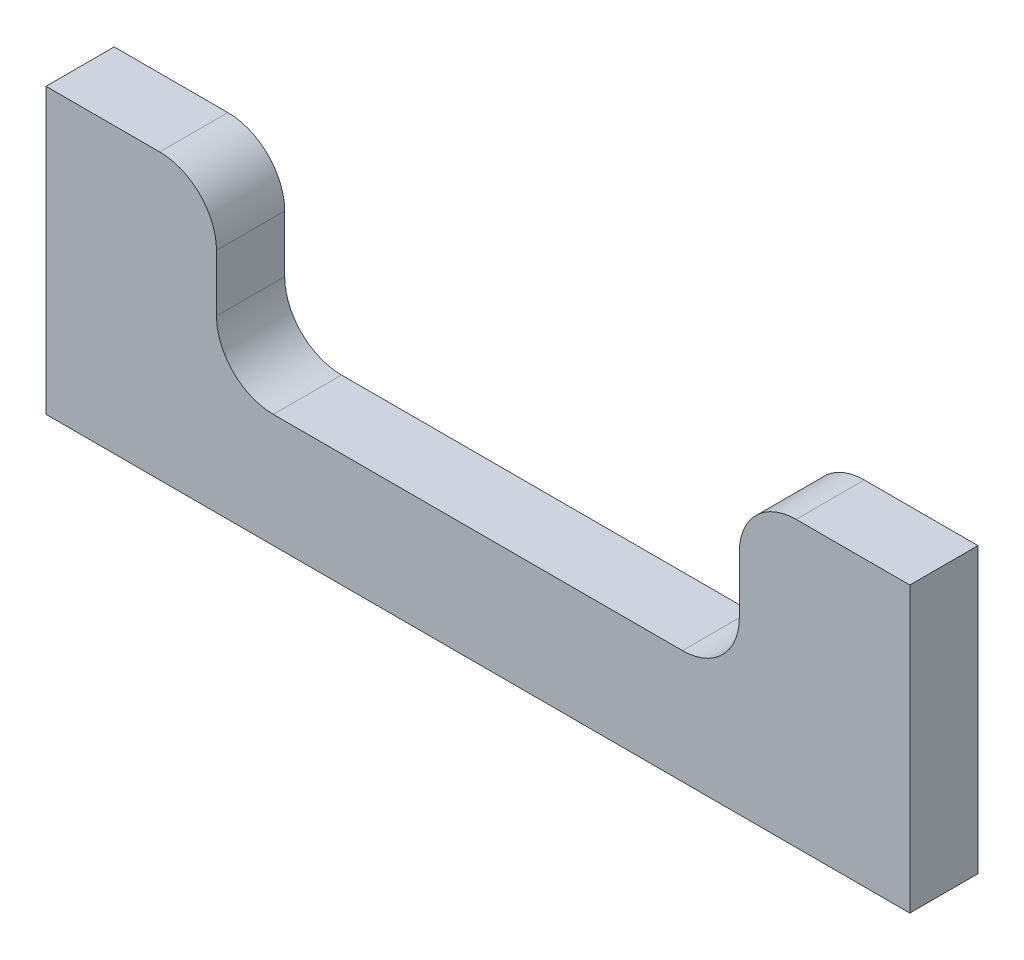
ISO-10303-21;
HEADER;
FILE_DESCRIPTION(('STEP AP214'),'2;1');
FILE_NAME('part.step','',(''),(''),'','','');
FILE_SCHEMA(('AUTOMOTIVE_DESIGN { 1 0 10303 214 1 1 1 1 }'));
ENDSEC;
DATA;
#1=APPLICATION_CONTEXT('core data for automotive mechanical design processes');
#2=APPLICATION_PROTOCOL_DEFINITION('international standard','automotive_design',2000,#1);
#3=PRODUCT_CONTEXT('',#1,'mechanical');
#4=PRODUCT('Part','Part','',(#3));
#5=PRODUCT_RELATED_PRODUCT_CATEGORY('part','',(#4));
#6=PRODUCT_DEFINITION_FORMATION('','',#4);
#7=PRODUCT_DEFINITION_CONTEXT('part definition',#1,'design');
#8=PRODUCT_DEFINITION('design','',#6,#7);
#9=PRODUCT_DEFINITION_SHAPE('','',#8);
#10=(LENGTH_UNIT() NAMED_UNIT(*) SI_UNIT(.MILLI.,.METRE.));
#11=(NAMED_UNIT(*) PLANE_ANGLE_UNIT() SI_UNIT($,.RADIAN.));
#12=(NAMED_UNIT(*) SI_UNIT($,.STERADIAN.) SOLID_ANGLE_UNIT());
#13=UNCERTAINTY_MEASURE_WITH_UNIT(LENGTH_MEASURE(1.E-05),#10,'distance_accuracy_value','');
#14=(GEOMETRIC_REPRESENTATION_CONTEXT(3) GLOBAL_UNCERTAINTY_ASSIGNED_CONTEXT((#13)) GLOBAL_UNIT_ASSIGNED_CONTEXT((#10,
#11,#12)) REPRESENTATION_CONTEXT('',''));
#15=CARTESIAN_POINT('',(0.,0.,0.));
#16=DIRECTION('',(0.,0.,1.));
#17=DIRECTION('',(1.,0.,0.));
#18=AXIS2_PLACEMENT_3D('',#15,#16,#17);
#19=CARTESIAN_POINT('',(23.,25.,6.));
#20=DIRECTION('',(1.,0.,0.));
#21=DIRECTION('',(0.,1.,0.));
#22=AXIS2_PLACEMENT_3D('',#19,#20,#21);
#23=PLANE('',#22);
#24=DIRECTION('',(0.,-1.,0.));
#25=VECTOR('',#24,1.);
#26=CARTESIAN_POINT('',(23.,25.,6.));
#27=LINE('',#26,#25);
#28=CARTESIAN_POINT('',(23.,20.,6.));
#29=VERTEX_POINT('',#28);
#30=CARTESIAN_POINT('',(23.,15.,6.));
#31=VERTEX_POINT('',#30);
#32=EDGE_CURVE('E177',#29,#31,#27,.T.);
#33=ORIENTED_EDGE('',*,*,#32,.F.);
#34=DIRECTION('',(0.,0.,-1.));
#35=VECTOR('',#34,1.);
#36=CARTESIAN_POINT('',(23.,20.,6.));
#37=LINE('',#36,#35);
#38=CARTESIAN_POINT('',(23.,20.,0.));
#39=VERTEX_POINT('',#38);
#40=EDGE_CURVE('E185',#29,#39,#37,.T.);
#41=ORIENTED_EDGE('',*,*,#40,.T.);
#42=DIRECTION('',(0.,-1.,0.));
#43=VECTOR('',#42,1.);
#44=CARTESIAN_POINT('',(23.,25.,0.));
#45=LINE('',#44,#43);
#46=CARTESIAN_POINT('',(23.,15.,0.));
#47=VERTEX_POINT('',#46);
#48=EDGE_CURVE('E159',#39,#47,#45,.T.);
#49=ORIENTED_EDGE('',*,*,#48,.T.);
#50=DIRECTION('',(0.,0.,-1.));
#51=VECTOR('',#50,1.);
#52=CARTESIAN_POINT('',(23.,15.,6.));
#53=LINE('',#52,#51);
#54=EDGE_CURVE('E143',#47,#31,#53,.F.);
#55=ORIENTED_EDGE('',*,*,#54,.T.);
#56=EDGE_LOOP('',(#33,#41,#49,#55));
#57=FACE_BOUND('',#56,.T.);
#58=ADVANCED_FACE('F37',(#57),#23,.F.);
#59=CARTESIAN_POINT('',(23.,9.99999999999999,6.));
#60=DIRECTION('',(0.,-1.,0.));
#61=DIRECTION('',(0.,0.,-1.));
#62=AXIS2_PLACEMENT_3D('',#59,#60,#61);
#63=PLANE('',#62);
#64=DIRECTION('',(-1.,0.,0.));
#65=VECTOR('',#64,1.);
#66=CARTESIAN_POINT('',(23.,9.99999999999999,6.));
#67=LINE('',#66,#65);
#68=CARTESIAN_POINT('',(18.,9.99999999999999,6.));
#69=VERTEX_POINT('',#68);
#70=CARTESIAN_POINT('',(-18.,9.99999999999999,6.));
#71=VERTEX_POINT('',#70);
#72=EDGE_CURVE('E226',#69,#71,#67,.T.);
#73=ORIENTED_EDGE('',*,*,#72,.F.);
#74=DIRECTION('',(0.,0.,-1.));
#75=VECTOR('',#74,1.);
#76=CARTESIAN_POINT('',(18.,9.99999999999999,0.));
#77=LINE('',#76,#75);
#78=CARTESIAN_POINT('',(18.,9.99999999999999,0.));
#79=VERTEX_POINT('',#78);
#80=EDGE_CURVE('E199',#69,#79,#77,.T.);
#81=ORIENTED_EDGE('',*,*,#80,.T.);
#82=DIRECTION('',(-1.,0.,0.));
#83=VECTOR('',#82,1.);
#84=CARTESIAN_POINT('',(23.,9.99999999999999,0.));
#85=LINE('',#84,#83);
#86=CARTESIAN_POINT('',(-18.,9.99999999999999,0.));
#87=VERTEX_POINT('',#86);
#88=EDGE_CURVE('E162',#79,#87,#85,.T.);
#89=ORIENTED_EDGE('',*,*,#88,.T.);
#90=DIRECTION('',(0.,0.,-1.));
#91=VECTOR('',#90,1.);
#92=CARTESIAN_POINT('',(-18.,9.99999999999999,6.));
#93=LINE('',#92,#91);
#94=EDGE_CURVE('E197',#87,#71,#93,.F.);
#95=ORIENTED_EDGE('',*,*,#94,.T.);
#96=EDGE_LOOP('',(#73,#81,#89,#95));
#97=FACE_BOUND('',#96,.T.);
#98=ADVANCED_FACE('F221',(#97),#63,.F.);
#99=CARTESIAN_POINT('',(-23.,25.,6.));
#100=DIRECTION('',(-1.,0.,0.));
#101=DIRECTION('',(0.,-1.,0.));
#102=AXIS2_PLACEMENT_3D('',#99,#100,#101);
#103=PLANE('',#102);
#104=DIRECTION('',(0.,1.,0.));
#105=VECTOR('',#104,1.);
#106=CARTESIAN_POINT('',(-23.,25.,6.));
#107=LINE('',#106,#105);
#108=CARTESIAN_POINT('',(-23.,15.,6.));
#109=VERTEX_POINT('',#108);
#110=CARTESIAN_POINT('',(-23.,20.,6.));
#111=VERTEX_POINT('',#110);
#112=EDGE_CURVE('E134',#109,#111,#107,.T.);
#113=ORIENTED_EDGE('',*,*,#112,.F.);
#114=DIRECTION('',(0.,0.,-1.));
#115=VECTOR('',#114,1.);
#116=CARTESIAN_POINT('',(-23.,15.,0.));
#117=LINE('',#116,#115);
#118=CARTESIAN_POINT('',(-23.,15.,0.));
#119=VERTEX_POINT('',#118);
#120=EDGE_CURVE('E203',#109,#119,#117,.T.);
#121=ORIENTED_EDGE('',*,*,#120,.T.);
#122=DIRECTION('',(0.,1.,0.));
#123=VECTOR('',#122,1.);
#124=CARTESIAN_POINT('',(-23.,25.,0.));
#125=LINE('',#124,#123);
#126=CARTESIAN_POINT('',(-23.,20.,0.));
#127=VERTEX_POINT('',#126);
#128=EDGE_CURVE('E165',#119,#127,#125,.T.);
#129=ORIENTED_EDGE('',*,*,#128,.T.);
#130=DIRECTION('',(0.,0.,-1.));
#131=VECTOR('',#130,1.);
#132=CARTESIAN_POINT('',(-23.,20.,6.));
#133=LINE('',#132,#131);
#134=EDGE_CURVE('E60',#127,#111,#133,.F.);
#135=ORIENTED_EDGE('',*,*,#134,.T.);
#136=EDGE_LOOP('',(#113,#121,#129,#135));
#137=FACE_BOUND('',#136,.T.);
#138=ADVANCED_FACE('F227',(#137),#103,.F.);
#139=CARTESIAN_POINT('',(-38.,25.,6.));
#140=DIRECTION('',(0.,-1.,0.));
#141=DIRECTION('',(1.,0.,0.));
#142=AXIS2_PLACEMENT_3D('',#139,#140,#141);
#143=PLANE('',#142);
#144=DIRECTION('',(-1.,0.,0.));
#145=VECTOR('',#144,1.);
#146=CARTESIAN_POINT('',(-38.,25.,6.));
#147=LINE('',#146,#145);
#148=CARTESIAN_POINT('',(-28.,25.,6.));
#149=VERTEX_POINT('',#148);
#150=CARTESIAN_POINT('',(-38.,25.,6.));
#151=VERTEX_POINT('',#150);
#152=EDGE_CURVE('E124',#149,#151,#147,.T.);
#153=ORIENTED_EDGE('',*,*,#152,.F.);
#154=DIRECTION('',(0.,0.,-1.));
#155=VECTOR('',#154,1.);
#156=CARTESIAN_POINT('',(-28.,25.,6.));
#157=LINE('',#156,#155);
#158=CARTESIAN_POINT('',(-28.,25.,0.));
#159=VERTEX_POINT('',#158);
#160=EDGE_CURVE('E206',#149,#159,#157,.T.);
#161=ORIENTED_EDGE('',*,*,#160,.T.);
#162=DIRECTION('',(-1.,0.,0.));
#163=VECTOR('',#162,1.);
#164=CARTESIAN_POINT('',(-38.,25.,0.));
#165=LINE('',#164,#163);
#166=CARTESIAN_POINT('',(-38.,25.,0.));
#167=VERTEX_POINT('',#166);
#168=EDGE_CURVE('E140',#159,#167,#165,.T.);
#169=ORIENTED_EDGE('',*,*,#168,.T.);
#170=DIRECTION('',(0.,0.,-1.));
#171=VECTOR('',#170,1.);
#172=CARTESIAN_POINT('',(-38.,25.,6.));
#173=LINE('',#172,#171);
#174=EDGE_CURVE('E137',#151,#167,#173,.T.);
#175=ORIENTED_EDGE('',*,*,#174,.F.);
#176=EDGE_LOOP('',(#153,#161,#169,#175));
#177=FACE_BOUND('',#176,.T.);
#178=ADVANCED_FACE('F138',(#177),#143,.F.);
#179=CARTESIAN_POINT('',(-38.,0.,6.));
#180=DIRECTION('',(1.,0.,0.));
#181=DIRECTION('',(0.,0.,-1.));
#182=AXIS2_PLACEMENT_3D('',#179,#180,#181);
#183=PLANE('',#182);
#184=DIRECTION('',(0.,-1.,0.));
#185=VECTOR('',#184,1.);
#186=CARTESIAN_POINT('',(-38.,0.,0.));
#187=LINE('',#186,#185);
#188=CARTESIAN_POINT('',(-38.,0.,0.));
#189=VERTEX_POINT('',#188);
#190=EDGE_CURVE('E168',#167,#189,#187,.T.);
#191=ORIENTED_EDGE('',*,*,#190,.T.);
#192=DIRECTION('',(0.,0.,-1.));
#193=VECTOR('',#192,1.);
#194=CARTESIAN_POINT('',(-38.,0.,6.));
#195=LINE('',#194,#193);
#196=CARTESIAN_POINT('',(-38.,0.,6.));
#197=VERTEX_POINT('',#196);
#198=EDGE_CURVE('E144',#197,#189,#195,.T.);
#199=ORIENTED_EDGE('',*,*,#198,.F.);
#200=DIRECTION('',(0.,-1.,0.));
#201=VECTOR('',#200,1.);
#202=CARTESIAN_POINT('',(-38.,0.,6.));
#203=LINE('',#202,#201);
#204=EDGE_CURVE('E129',#151,#197,#203,.T.);
#205=ORIENTED_EDGE('',*,*,#204,.F.);
#206=ORIENTED_EDGE('',*,*,#174,.T.);
#207=EDGE_LOOP('',(#191,#199,#205,#206));
#208=FACE_BOUND('',#207,.T.);
#209=ADVANCED_FACE('F146',(#208),#183,.F.);
#210=CARTESIAN_POINT('',(-38.,0.,6.));
#211=DIRECTION('',(0.,1.,0.));
#212=DIRECTION('',(0.,0.,1.));
#213=AXIS2_PLACEMENT_3D('',#210,#211,#212);
#214=PLANE('',#213);
#215=DIRECTION('',(1.,0.,0.));
#216=VECTOR('',#215,1.);
#217=CARTESIAN_POINT('',(-38.,0.,0.));
#218=LINE('',#217,#216);
#219=CARTESIAN_POINT('',(38.,0.,0.));
#220=VERTEX_POINT('',#219);
#221=EDGE_CURVE('E170',#189,#220,#218,.T.);
#222=ORIENTED_EDGE('',*,*,#221,.T.);
#223=DIRECTION('',(0.,0.,-1.));
#224=VECTOR('',#223,1.);
#225=CARTESIAN_POINT('',(38.,0.,6.));
#226=LINE('',#225,#224);
#227=CARTESIAN_POINT('',(38.,0.,6.));
#228=VERTEX_POINT('',#227);
#229=EDGE_CURVE('E180',#228,#220,#226,.T.);
#230=ORIENTED_EDGE('',*,*,#229,.F.);
#231=DIRECTION('',(1.,0.,0.));
#232=VECTOR('',#231,1.);
#233=CARTESIAN_POINT('',(-38.,0.,6.));
#234=LINE('',#233,#232);
#235=EDGE_CURVE('E149',#197,#228,#234,.T.);
#236=ORIENTED_EDGE('',*,*,#235,.F.);
#237=ORIENTED_EDGE('',*,*,#198,.T.);
#238=EDGE_LOOP('',(#222,#230,#236,#237));
#239=FACE_BOUND('',#238,.T.);
#240=ADVANCED_FACE('F254',(#239),#214,.F.);
#241=CARTESIAN_POINT('',(38.,0.,6.));
#242=DIRECTION('',(-1.,0.,0.));
#243=DIRECTION('',(0.,0.,1.));
#244=AXIS2_PLACEMENT_3D('',#241,#242,#243);
#245=PLANE('',#244);
#246=DIRECTION('',(0.,1.,0.));
#247=VECTOR('',#246,1.);
#248=CARTESIAN_POINT('',(38.,0.,0.));
#249=LINE('',#248,#247);
#250=CARTESIAN_POINT('',(38.,25.,0.));
#251=VERTEX_POINT('',#250);
#252=EDGE_CURVE('E172',#220,#251,#249,.T.);
#253=ORIENTED_EDGE('',*,*,#252,.T.);
#254=DIRECTION('',(0.,0.,-1.));
#255=VECTOR('',#254,1.);
#256=CARTESIAN_POINT('',(38.,25.,6.));
#257=LINE('',#256,#255);
#258=CARTESIAN_POINT('',(38.,25.,6.));
#259=VERTEX_POINT('',#258);
#260=EDGE_CURVE('E158',#259,#251,#257,.T.);
#261=ORIENTED_EDGE('',*,*,#260,.F.);
#262=DIRECTION('',(0.,1.,0.));
#263=VECTOR('',#262,1.);
#264=CARTESIAN_POINT('',(38.,0.,6.));
#265=LINE('',#264,#263);
#266=EDGE_CURVE('E151',#228,#259,#265,.T.);
#267=ORIENTED_EDGE('',*,*,#266,.F.);
#268=ORIENTED_EDGE('',*,*,#229,.T.);
#269=EDGE_LOOP('',(#253,#261,#267,#268));
#270=FACE_BOUND('',#269,.T.);
#271=ADVANCED_FACE('F250',(#270),#245,.F.);
#272=CARTESIAN_POINT('',(38.,25.,6.));
#273=DIRECTION('',(0.,-1.,0.));
#274=DIRECTION('',(1.,0.,0.));
#275=AXIS2_PLACEMENT_3D('',#272,#273,#274);
#276=PLANE('',#275);
#277=DIRECTION('',(-1.,0.,0.));
#278=VECTOR('',#277,1.);
#279=CARTESIAN_POINT('',(38.,25.,0.));
#280=LINE('',#279,#278);
#281=CARTESIAN_POINT('',(28.,25.,0.));
#282=VERTEX_POINT('',#281);
#283=EDGE_CURVE('E174',#251,#282,#280,.T.);
#284=ORIENTED_EDGE('',*,*,#283,.T.);
#285=DIRECTION('',(0.,0.,-1.));
#286=VECTOR('',#285,1.);
#287=CARTESIAN_POINT('',(28.,25.,6.));
#288=LINE('',#287,#286);
#289=CARTESIAN_POINT('',(28.,25.,6.));
#290=VERTEX_POINT('',#289);
#291=EDGE_CURVE('E192',#282,#290,#288,.F.);
#292=ORIENTED_EDGE('',*,*,#291,.T.);
#293=DIRECTION('',(-1.,0.,0.));
#294=VECTOR('',#293,1.);
#295=CARTESIAN_POINT('',(38.,25.,6.));
#296=LINE('',#295,#294);
#297=EDGE_CURVE('E156',#259,#290,#296,.T.);
#298=ORIENTED_EDGE('',*,*,#297,.F.);
#299=ORIENTED_EDGE('',*,*,#260,.T.);
#300=EDGE_LOOP('',(#284,#292,#298,#299));
#301=FACE_BOUND('',#300,.T.);
#302=ADVANCED_FACE('F245',(#301),#276,.F.);
#303=CARTESIAN_POINT('',(0.,0.,6.));
#304=DIRECTION('',(0.,0.,-1.));
#305=DIRECTION('',(-1.,0.,0.));
#306=AXIS2_PLACEMENT_3D('',#303,#304,#305);
#307=PLANE('',#306);
#308=ORIENTED_EDGE('',*,*,#297,.T.);
#309=CARTESIAN_POINT('',(28.,20.,6.));
#310=DIRECTION('',(0.,0.,-1.));
#311=DIRECTION('',(-1.,0.,0.));
#312=AXIS2_PLACEMENT_3D('',#309,#310,#311);
#313=CIRCLE('',#312,5.);
#314=EDGE_CURVE('E195',#290,#29,#313,.F.);
#315=ORIENTED_EDGE('',*,*,#314,.T.);
#316=ORIENTED_EDGE('',*,*,#32,.T.);
#317=CARTESIAN_POINT('',(18.,15.,6.));
#318=DIRECTION('',(0.,0.,-1.));
#319=DIRECTION('',(-1.,0.,0.));
#320=AXIS2_PLACEMENT_3D('',#317,#318,#319);
#321=CIRCLE('',#320,5.);
#322=EDGE_CURVE('E210',#31,#69,#321,.T.);
#323=ORIENTED_EDGE('',*,*,#322,.T.);
#324=ORIENTED_EDGE('',*,*,#72,.T.);
#325=CARTESIAN_POINT('',(-18.,15.,6.));
#326=DIRECTION('',(0.,0.,-1.));
#327=DIRECTION('',(-1.,0.,0.));
#328=AXIS2_PLACEMENT_3D('',#325,#326,#327);
#329=CIRCLE('',#328,5.);
#330=EDGE_CURVE('E11',#71,#109,#329,.T.);
#331=ORIENTED_EDGE('',*,*,#330,.T.);
#332=ORIENTED_EDGE('',*,*,#112,.T.);
#333=CARTESIAN_POINT('',(-28.,20.,6.));
#334=DIRECTION('',(0.,0.,-1.));
#335=DIRECTION('',(-1.,0.,0.));
#336=AXIS2_PLACEMENT_3D('',#333,#334,#335);
#337=CIRCLE('',#336,5.);
#338=EDGE_CURVE('E52',#111,#149,#337,.F.);
#339=ORIENTED_EDGE('',*,*,#338,.T.);
#340=ORIENTED_EDGE('',*,*,#152,.T.);
#341=ORIENTED_EDGE('',*,*,#204,.T.);
#342=ORIENTED_EDGE('',*,*,#235,.T.);
#343=ORIENTED_EDGE('',*,*,#266,.T.);
#344=EDGE_LOOP('',(#308,#315,#316,#323,#324,#331,#332,#339,#340,#341,#342,#343));
#345=FACE_BOUND('',#344,.T.);
#346=ADVANCED_FACE('F127',(#345),#307,.F.);
#347=CARTESIAN_POINT('',(0.,0.,0.));
#348=DIRECTION('',(0.,0.,-1.));
#349=DIRECTION('',(-1.,0.,0.));
#350=AXIS2_PLACEMENT_3D('',#347,#348,#349);
#351=PLANE('',#350);
#352=ORIENTED_EDGE('',*,*,#48,.F.);
#353=CARTESIAN_POINT('',(28.,20.,0.));
#354=DIRECTION('',(0.,0.,-1.));
#355=DIRECTION('',(-1.,0.,0.));
#356=AXIS2_PLACEMENT_3D('',#353,#354,#355);
#357=CIRCLE('',#356,5.);
#358=EDGE_CURVE('E190',#39,#282,#357,.T.);
#359=ORIENTED_EDGE('',*,*,#358,.T.);
#360=ORIENTED_EDGE('',*,*,#283,.F.);
#361=ORIENTED_EDGE('',*,*,#252,.F.);
#362=ORIENTED_EDGE('',*,*,#221,.F.);
#363=ORIENTED_EDGE('',*,*,#190,.F.);
#364=ORIENTED_EDGE('',*,*,#168,.F.);
#365=CARTESIAN_POINT('',(-28.,20.,0.));
#366=DIRECTION('',(0.,0.,-1.));
#367=DIRECTION('',(-1.,0.,0.));
#368=AXIS2_PLACEMENT_3D('',#365,#366,#367);
#369=CIRCLE('',#368,5.);
#370=EDGE_CURVE('E188',#159,#127,#369,.T.);
#371=ORIENTED_EDGE('',*,*,#370,.T.);
#372=ORIENTED_EDGE('',*,*,#128,.F.);
#373=CARTESIAN_POINT('',(-18.,15.,0.));
#374=DIRECTION('',(0.,0.,-1.));
#375=DIRECTION('',(-1.,0.,0.));
#376=AXIS2_PLACEMENT_3D('',#373,#374,#375);
#377=CIRCLE('',#376,5.);
#378=EDGE_CURVE('E45',#119,#87,#377,.F.);
#379=ORIENTED_EDGE('',*,*,#378,.T.);
#380=ORIENTED_EDGE('',*,*,#88,.F.);
#381=CARTESIAN_POINT('',(18.,15.,0.));
#382=DIRECTION('',(0.,0.,-1.));
#383=DIRECTION('',(-1.,0.,0.));
#384=AXIS2_PLACEMENT_3D('',#381,#382,#383);
#385=CIRCLE('',#384,5.);
#386=EDGE_CURVE('E208',#79,#47,#385,.F.);
#387=ORIENTED_EDGE('',*,*,#386,.T.);
#388=EDGE_LOOP('',(#352,#359,#360,#361,#362,#363,#364,#371,#372,#379,#380,#387));
#389=FACE_BOUND('',#388,.T.);
#390=ADVANCED_FACE('F215',(#389),#351,.T.);
#391=CARTESIAN_POINT('',(28.,20.,6.));
#392=DIRECTION('',(0.,0.,-1.));
#393=DIRECTION('',(-1.,0.,0.));
#394=AXIS2_PLACEMENT_3D('',#391,#392,#393);
#395=CYLINDRICAL_SURFACE('',#394,5.);
#396=ORIENTED_EDGE('',*,*,#314,.F.);
#397=ORIENTED_EDGE('',*,*,#291,.F.);
#398=ORIENTED_EDGE('',*,*,#358,.F.);
#399=ORIENTED_EDGE('',*,*,#40,.F.);
#400=EDGE_LOOP('',(#396,#397,#398,#399));
#401=FACE_BOUND('',#400,.T.);
#402=ADVANCED_FACE('F240',(#401),#395,.T.);
#403=CARTESIAN_POINT('',(18.,15.,6.));
#404=DIRECTION('',(0.,0.,1.));
#405=DIRECTION('',(1.,0.,0.));
#406=AXIS2_PLACEMENT_3D('',#403,#404,#405);
#407=CYLINDRICAL_SURFACE('',#406,5.);
#408=ORIENTED_EDGE('',*,*,#322,.F.);
#409=ORIENTED_EDGE('',*,*,#54,.F.);
#410=ORIENTED_EDGE('',*,*,#386,.F.);
#411=ORIENTED_EDGE('',*,*,#80,.F.);
#412=EDGE_LOOP('',(#408,#409,#410,#411));
#413=FACE_BOUND('',#412,.T.);
#414=ADVANCED_FACE('F238',(#413),#407,.F.);
#415=CARTESIAN_POINT('',(-18.,15.,6.));
#416=DIRECTION('',(0.,0.,1.));
#417=DIRECTION('',(1.,0.,0.));
#418=AXIS2_PLACEMENT_3D('',#415,#416,#417);
#419=CYLINDRICAL_SURFACE('',#418,5.);
#420=ORIENTED_EDGE('',*,*,#330,.F.);
#421=ORIENTED_EDGE('',*,*,#94,.F.);
#422=ORIENTED_EDGE('',*,*,#378,.F.);
#423=ORIENTED_EDGE('',*,*,#120,.F.);
#424=EDGE_LOOP('',(#420,#421,#422,#423));
#425=FACE_BOUND('',#424,.T.);
#426=ADVANCED_FACE('F225',(#425),#419,.F.);
#427=CARTESIAN_POINT('',(-28.,20.,6.));
#428=DIRECTION('',(0.,0.,-1.));
#429=DIRECTION('',(-1.,0.,0.));
#430=AXIS2_PLACEMENT_3D('',#427,#428,#429);
#431=CYLINDRICAL_SURFACE('',#430,5.);
#432=ORIENTED_EDGE('',*,*,#338,.F.);
#433=ORIENTED_EDGE('',*,*,#134,.F.);
#434=ORIENTED_EDGE('',*,*,#370,.F.);
#435=ORIENTED_EDGE('',*,*,#160,.F.);
#436=EDGE_LOOP('',(#432,#433,#434,#435));
#437=FACE_BOUND('',#436,.T.);
#438=ADVANCED_FACE('F39',(#437),#431,.T.);
#439=CLOSED_SHELL('',(#58,#98,#138,#178,#209,#240,#271,#302,#346,#390,#402,#414,#426,#438));
#440=MANIFOLD_SOLID_BREP('B2',#439);
#441=ADVANCED_BREP_SHAPE_REPRESENTATION('',(#18,#440),#14);
#442=SHAPE_DEFINITION_REPRESENTATION(#9,#441);
ENDSEC;
END-ISO-10303-21;
